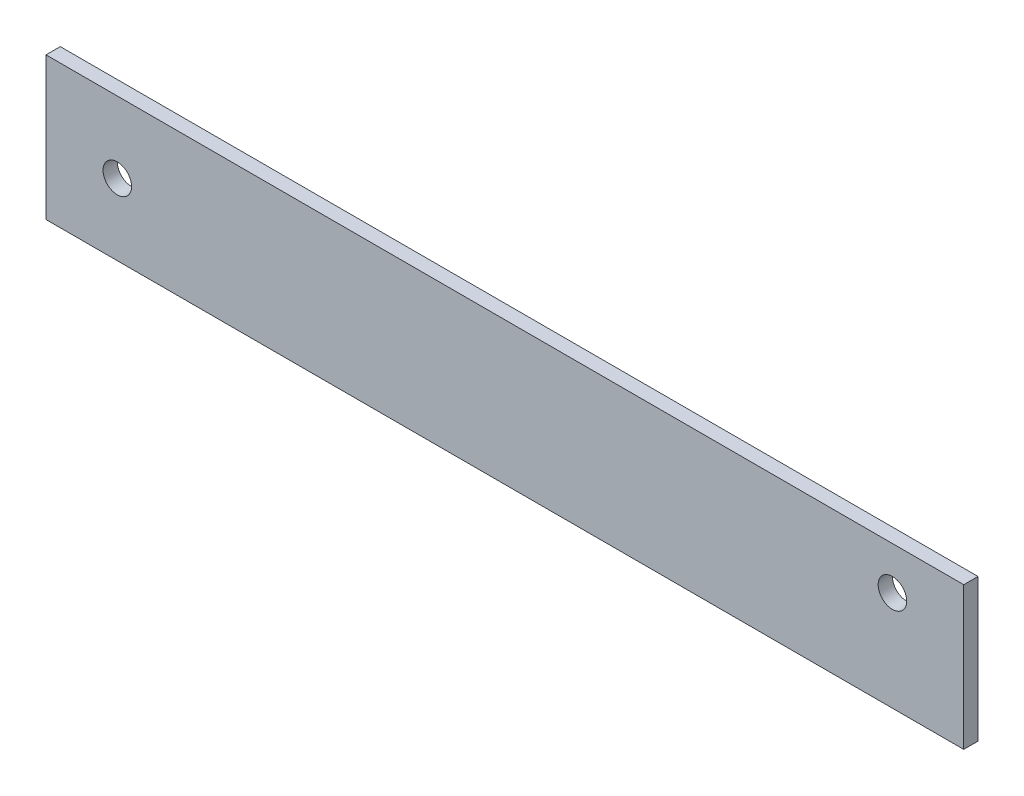
ISO-10303-21;
HEADER;
FILE_DESCRIPTION(('STEP AP214'),'2;1');
FILE_NAME('part.step','',(''),(''),'','','');
FILE_SCHEMA(('AUTOMOTIVE_DESIGN { 1 0 10303 214 1 1 1 1 }'));
ENDSEC;
DATA;
#1=APPLICATION_CONTEXT('core data for automotive mechanical design processes');
#2=APPLICATION_PROTOCOL_DEFINITION('international standard','automotive_design',2000,#1);
#3=PRODUCT_CONTEXT('',#1,'mechanical');
#4=PRODUCT('Part','Part','',(#3));
#5=PRODUCT_RELATED_PRODUCT_CATEGORY('part','',(#4));
#6=PRODUCT_DEFINITION_FORMATION('','',#4);
#7=PRODUCT_DEFINITION_CONTEXT('part definition',#1,'design');
#8=PRODUCT_DEFINITION('design','',#6,#7);
#9=PRODUCT_DEFINITION_SHAPE('','',#8);
#10=(LENGTH_UNIT() NAMED_UNIT(*) SI_UNIT(.MILLI.,.METRE.));
#11=(NAMED_UNIT(*) PLANE_ANGLE_UNIT() SI_UNIT($,.RADIAN.));
#12=(NAMED_UNIT(*) SI_UNIT($,.STERADIAN.) SOLID_ANGLE_UNIT());
#13=UNCERTAINTY_MEASURE_WITH_UNIT(LENGTH_MEASURE(1.E-05),#10,'distance_accuracy_value','');
#14=(GEOMETRIC_REPRESENTATION_CONTEXT(3) GLOBAL_UNCERTAINTY_ASSIGNED_CONTEXT((#13)) GLOBAL_UNIT_ASSIGNED_CONTEXT((#10,
#11,#12)) REPRESENTATION_CONTEXT('',''));
#15=CARTESIAN_POINT('',(0.,0.,0.));
#16=DIRECTION('',(0.,0.,1.));
#17=DIRECTION('',(1.,0.,0.));
#18=AXIS2_PLACEMENT_3D('',#15,#16,#17);
#19=CARTESIAN_POINT('',(-35.711038078303,-3.32683315621679,1.5));
#20=DIRECTION('',(0.,0.,1.));
#21=DIRECTION('',(1.,0.,0.));
#22=AXIS2_PLACEMENT_3D('',#19,#20,#21);
#23=PLANE('',#22);
#24=CARTESIAN_POINT('',(-28.211038078303,4.17316684378321,1.5));
#25=DIRECTION('',(0.,0.,1.));
#26=DIRECTION('',(1.,0.,0.));
#27=AXIS2_PLACEMENT_3D('',#24,#25,#26);
#28=CIRCLE('',#27,1.5);
#29=CARTESIAN_POINT('',(-26.711038078303,4.17316684378321,1.5));
#30=VERTEX_POINT('',#29);
#31=EDGE_CURVE('E98',#30,#30,#28,.T.);
#32=ORIENTED_EDGE('',*,*,#31,.F.);
#33=EDGE_LOOP('',(#32));
#34=FACE_BOUND('',#33,.T.);
#35=DIRECTION('',(0.,-1.,0.));
#36=VECTOR('',#35,1.);
#37=CARTESIAN_POINT('',(-35.711038078303,11.6731668437832,1.5));
#38=LINE('',#37,#36);
#39=CARTESIAN_POINT('',(-35.711038078303,11.6731668437832,1.5));
#40=VERTEX_POINT('',#39);
#41=CARTESIAN_POINT('',(-35.711038078303,-3.32683315621679,1.5));
#42=VERTEX_POINT('',#41);
#43=EDGE_CURVE('E83',#40,#42,#38,.T.);
#44=ORIENTED_EDGE('',*,*,#43,.T.);
#45=DIRECTION('',(1.,0.,0.));
#46=VECTOR('',#45,1.);
#47=CARTESIAN_POINT('',(-35.711038078303,-3.32683315621679,1.5));
#48=LINE('',#47,#46);
#49=CARTESIAN_POINT('',(60.788961921697,-3.32683315621679,1.5));
#50=VERTEX_POINT('',#49);
#51=EDGE_CURVE('E78',#42,#50,#48,.T.);
#52=ORIENTED_EDGE('',*,*,#51,.T.);
#53=DIRECTION('',(0.,1.,0.));
#54=VECTOR('',#53,1.);
#55=CARTESIAN_POINT('',(60.788961921697,11.6731668437832,1.5));
#56=LINE('',#55,#54);
#57=CARTESIAN_POINT('',(60.788961921697,11.6731668437832,1.5));
#58=VERTEX_POINT('',#57);
#59=EDGE_CURVE('E81',#50,#58,#56,.T.);
#60=ORIENTED_EDGE('',*,*,#59,.T.);
#61=DIRECTION('',(-1.,0.,0.));
#62=VECTOR('',#61,1.);
#63=CARTESIAN_POINT('',(-35.711038078303,11.6731668437832,1.5));
#64=LINE('',#63,#62);
#65=EDGE_CURVE('E48',#58,#40,#64,.T.);
#66=ORIENTED_EDGE('',*,*,#65,.T.);
#67=EDGE_LOOP('',(#44,#52,#60,#66));
#68=FACE_BOUND('',#67,.T.);
#69=CARTESIAN_POINT('',(53.288961921697,7.17316684378321,1.5));
#70=DIRECTION('',(0.,0.,1.));
#71=DIRECTION('',(1.,0.,0.));
#72=AXIS2_PLACEMENT_3D('',#69,#70,#71);
#73=CIRCLE('',#72,1.5);
#74=CARTESIAN_POINT('',(54.788961921697,7.17316684378321,1.5));
#75=VERTEX_POINT('',#74);
#76=EDGE_CURVE('E113',#75,#75,#73,.T.);
#77=ORIENTED_EDGE('',*,*,#76,.F.);
#78=EDGE_LOOP('',(#77));
#79=FACE_BOUND('',#78,.T.);
#80=ADVANCED_FACE('F31',(#34,#68,#79),#23,.T.);
#81=CARTESIAN_POINT('',(-35.711038078303,-3.32683315621679,0.));
#82=DIRECTION('',(0.,0.,1.));
#83=DIRECTION('',(1.,0.,0.));
#84=AXIS2_PLACEMENT_3D('',#81,#82,#83);
#85=PLANE('',#84);
#86=CARTESIAN_POINT('',(-28.211038078303,4.17316684378321,0.));
#87=DIRECTION('',(0.,0.,1.));
#88=DIRECTION('',(1.,0.,0.));
#89=AXIS2_PLACEMENT_3D('',#86,#87,#88);
#90=CIRCLE('',#89,1.5);
#91=CARTESIAN_POINT('',(-26.711038078303,4.17316684378321,0.));
#92=VERTEX_POINT('',#91);
#93=EDGE_CURVE('E110',#92,#92,#90,.T.);
#94=ORIENTED_EDGE('',*,*,#93,.T.);
#95=EDGE_LOOP('',(#94));
#96=FACE_BOUND('',#95,.T.);
#97=DIRECTION('',(0.,-1.,0.));
#98=VECTOR('',#97,1.);
#99=CARTESIAN_POINT('',(-35.711038078303,11.6731668437832,0.));
#100=LINE('',#99,#98);
#101=CARTESIAN_POINT('',(-35.711038078303,11.6731668437832,0.));
#102=VERTEX_POINT('',#101);
#103=CARTESIAN_POINT('',(-35.711038078303,-3.32683315621679,0.));
#104=VERTEX_POINT('',#103);
#105=EDGE_CURVE('E95',#102,#104,#100,.T.);
#106=ORIENTED_EDGE('',*,*,#105,.F.);
#107=DIRECTION('',(-1.,0.,0.));
#108=VECTOR('',#107,1.);
#109=CARTESIAN_POINT('',(-35.711038078303,11.6731668437832,0.));
#110=LINE('',#109,#108);
#111=CARTESIAN_POINT('',(60.788961921697,11.6731668437832,0.));
#112=VERTEX_POINT('',#111);
#113=EDGE_CURVE('E71',#112,#102,#110,.T.);
#114=ORIENTED_EDGE('',*,*,#113,.F.);
#115=DIRECTION('',(0.,1.,0.));
#116=VECTOR('',#115,1.);
#117=CARTESIAN_POINT('',(60.788961921697,11.6731668437832,0.));
#118=LINE('',#117,#116);
#119=CARTESIAN_POINT('',(60.788961921697,-3.32683315621679,0.));
#120=VERTEX_POINT('',#119);
#121=EDGE_CURVE('E65',#120,#112,#118,.T.);
#122=ORIENTED_EDGE('',*,*,#121,.F.);
#123=DIRECTION('',(1.,0.,0.));
#124=VECTOR('',#123,1.);
#125=CARTESIAN_POINT('',(-35.711038078303,-3.32683315621679,0.));
#126=LINE('',#125,#124);
#127=EDGE_CURVE('E87',#104,#120,#126,.T.);
#128=ORIENTED_EDGE('',*,*,#127,.F.);
#129=EDGE_LOOP('',(#106,#114,#122,#128));
#130=FACE_BOUND('',#129,.T.);
#131=CARTESIAN_POINT('',(53.288961921697,7.17316684378321,0.));
#132=DIRECTION('',(0.,0.,1.));
#133=DIRECTION('',(1.,0.,0.));
#134=AXIS2_PLACEMENT_3D('',#131,#132,#133);
#135=CIRCLE('',#134,1.5);
#136=CARTESIAN_POINT('',(54.788961921697,7.17316684378321,0.));
#137=VERTEX_POINT('',#136);
#138=EDGE_CURVE('E116',#137,#137,#135,.T.);
#139=ORIENTED_EDGE('',*,*,#138,.T.);
#140=EDGE_LOOP('',(#139));
#141=FACE_BOUND('',#140,.T.);
#142=ADVANCED_FACE('F106',(#96,#130,#141),#85,.F.);
#143=CARTESIAN_POINT('',(-35.711038078303,11.6731668437832,1.5));
#144=DIRECTION('',(1.,0.,0.));
#145=DIRECTION('',(0.,0.,-1.));
#146=AXIS2_PLACEMENT_3D('',#143,#144,#145);
#147=PLANE('',#146);
#148=ORIENTED_EDGE('',*,*,#105,.T.);
#149=DIRECTION('',(0.,0.,-1.));
#150=VECTOR('',#149,1.);
#151=CARTESIAN_POINT('',(-35.711038078303,-3.32683315621679,1.5));
#152=LINE('',#151,#150);
#153=EDGE_CURVE('E11',#42,#104,#152,.T.);
#154=ORIENTED_EDGE('',*,*,#153,.F.);
#155=ORIENTED_EDGE('',*,*,#43,.F.);
#156=DIRECTION('',(0.,0.,-1.));
#157=VECTOR('',#156,1.);
#158=CARTESIAN_POINT('',(-35.711038078303,11.6731668437832,1.5));
#159=LINE('',#158,#157);
#160=EDGE_CURVE('E91',#40,#102,#159,.T.);
#161=ORIENTED_EDGE('',*,*,#160,.T.);
#162=EDGE_LOOP('',(#148,#154,#155,#161));
#163=FACE_BOUND('',#162,.T.);
#164=ADVANCED_FACE('F33',(#163),#147,.F.);
#165=CARTESIAN_POINT('',(-35.711038078303,-3.32683315621679,1.5));
#166=DIRECTION('',(0.,1.,0.));
#167=DIRECTION('',(0.,0.,1.));
#168=AXIS2_PLACEMENT_3D('',#165,#166,#167);
#169=PLANE('',#168);
#170=ORIENTED_EDGE('',*,*,#127,.T.);
#171=DIRECTION('',(0.,0.,-1.));
#172=VECTOR('',#171,1.);
#173=CARTESIAN_POINT('',(60.788961921697,-3.32683315621679,1.5));
#174=LINE('',#173,#172);
#175=EDGE_CURVE('E40',#50,#120,#174,.T.);
#176=ORIENTED_EDGE('',*,*,#175,.F.);
#177=ORIENTED_EDGE('',*,*,#51,.F.);
#178=ORIENTED_EDGE('',*,*,#153,.T.);
#179=EDGE_LOOP('',(#170,#176,#177,#178));
#180=FACE_BOUND('',#179,.T.);
#181=ADVANCED_FACE('F86',(#180),#169,.F.);
#182=CARTESIAN_POINT('',(60.788961921697,11.6731668437832,1.5));
#183=DIRECTION('',(-1.,0.,0.));
#184=DIRECTION('',(0.,0.,1.));
#185=AXIS2_PLACEMENT_3D('',#182,#183,#184);
#186=PLANE('',#185);
#187=ORIENTED_EDGE('',*,*,#121,.T.);
#188=DIRECTION('',(0.,0.,-1.));
#189=VECTOR('',#188,1.);
#190=CARTESIAN_POINT('',(60.788961921697,11.6731668437832,1.5));
#191=LINE('',#190,#189);
#192=EDGE_CURVE('E88',#58,#112,#191,.T.);
#193=ORIENTED_EDGE('',*,*,#192,.F.);
#194=ORIENTED_EDGE('',*,*,#59,.F.);
#195=ORIENTED_EDGE('',*,*,#175,.T.);
#196=EDGE_LOOP('',(#187,#193,#194,#195));
#197=FACE_BOUND('',#196,.T.);
#198=ADVANCED_FACE('F89',(#197),#186,.F.);
#199=CARTESIAN_POINT('',(-35.711038078303,11.6731668437832,1.5));
#200=DIRECTION('',(0.,-1.,0.));
#201=DIRECTION('',(0.,0.,-1.));
#202=AXIS2_PLACEMENT_3D('',#199,#200,#201);
#203=PLANE('',#202);
#204=ORIENTED_EDGE('',*,*,#113,.T.);
#205=ORIENTED_EDGE('',*,*,#160,.F.);
#206=ORIENTED_EDGE('',*,*,#65,.F.);
#207=ORIENTED_EDGE('',*,*,#192,.T.);
#208=EDGE_LOOP('',(#204,#205,#206,#207));
#209=FACE_BOUND('',#208,.T.);
#210=ADVANCED_FACE('F103',(#209),#203,.F.);
#211=CARTESIAN_POINT('',(-28.211038078303,4.17316684378321,1.5));
#212=DIRECTION('',(0.,0.,-1.));
#213=DIRECTION('',(-1.,0.,0.));
#214=AXIS2_PLACEMENT_3D('',#211,#212,#213);
#215=CYLINDRICAL_SURFACE('',#214,1.5);
#216=ORIENTED_EDGE('',*,*,#31,.T.);
#217=EDGE_LOOP('',(#216));
#218=FACE_BOUND('',#217,.T.);
#219=ORIENTED_EDGE('',*,*,#93,.F.);
#220=EDGE_LOOP('',(#219));
#221=FACE_BOUND('',#220,.T.);
#222=ADVANCED_FACE('F134',(#218,#221),#215,.F.);
#223=CARTESIAN_POINT('',(53.288961921697,7.17316684378321,1.5));
#224=DIRECTION('',(0.,0.,-1.));
#225=DIRECTION('',(-1.,0.,0.));
#226=AXIS2_PLACEMENT_3D('',#223,#224,#225);
#227=CYLINDRICAL_SURFACE('',#226,1.5);
#228=ORIENTED_EDGE('',*,*,#76,.T.);
#229=EDGE_LOOP('',(#228));
#230=FACE_BOUND('',#229,.T.);
#231=ORIENTED_EDGE('',*,*,#138,.F.);
#232=EDGE_LOOP('',(#231));
#233=FACE_BOUND('',#232,.T.);
#234=ADVANCED_FACE('F122',(#230,#233),#227,.F.);
#235=CLOSED_SHELL('',(#80,#142,#164,#181,#198,#210,#222,#234));
#236=MANIFOLD_SOLID_BREP('B2',#235);
#237=ADVANCED_BREP_SHAPE_REPRESENTATION('',(#18,#236),#14);
#238=SHAPE_DEFINITION_REPRESENTATION(#9,#237);
ENDSEC;
END-ISO-10303-21;
